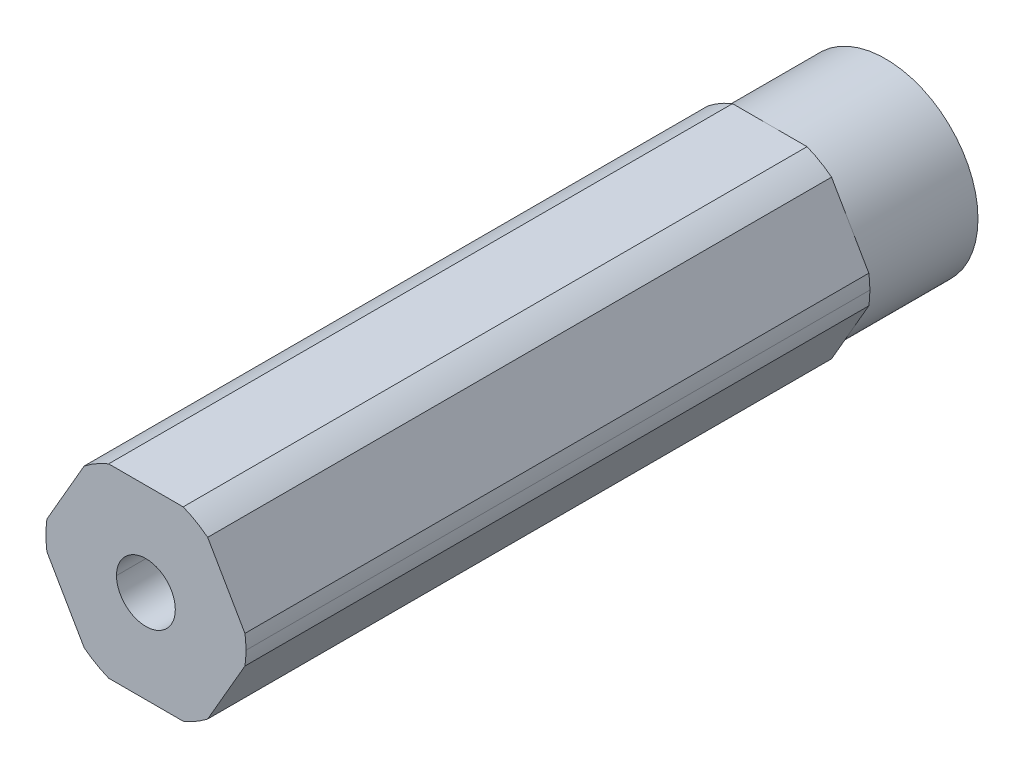
ISO-10303-21;
HEADER;
FILE_DESCRIPTION(('STEP AP214'),'2;1');
FILE_NAME('part.step','',(''),(''),'','','');
FILE_SCHEMA(('AUTOMOTIVE_DESIGN { 1 0 10303 214 1 1 1 1 }'));
ENDSEC;
DATA;
#1=APPLICATION_CONTEXT('core data for automotive mechanical design processes');
#2=APPLICATION_PROTOCOL_DEFINITION('international standard','automotive_design',2000,#1);
#3=PRODUCT_CONTEXT('',#1,'mechanical');
#4=PRODUCT('Part','Part','',(#3));
#5=PRODUCT_RELATED_PRODUCT_CATEGORY('part','',(#4));
#6=PRODUCT_DEFINITION_FORMATION('','',#4);
#7=PRODUCT_DEFINITION_CONTEXT('part definition',#1,'design');
#8=PRODUCT_DEFINITION('design','',#6,#7);
#9=PRODUCT_DEFINITION_SHAPE('','',#8);
#10=(LENGTH_UNIT() NAMED_UNIT(*) SI_UNIT(.MILLI.,.METRE.));
#11=(NAMED_UNIT(*) PLANE_ANGLE_UNIT() SI_UNIT($,.RADIAN.));
#12=(NAMED_UNIT(*) SI_UNIT($,.STERADIAN.) SOLID_ANGLE_UNIT());
#13=UNCERTAINTY_MEASURE_WITH_UNIT(LENGTH_MEASURE(1.E-05),#10,'distance_accuracy_value','');
#14=(GEOMETRIC_REPRESENTATION_CONTEXT(3) GLOBAL_UNCERTAINTY_ASSIGNED_CONTEXT((#13)) GLOBAL_UNIT_ASSIGNED_CONTEXT((#10,
#11,#12)) REPRESENTATION_CONTEXT('',''));
#15=CARTESIAN_POINT('',(0.,0.,0.));
#16=DIRECTION('',(0.,0.,1.));
#17=DIRECTION('',(1.,0.,0.));
#18=AXIS2_PLACEMENT_3D('',#15,#16,#17);
#19=CARTESIAN_POINT('',(0.,0.,-457.2));
#20=DIRECTION('',(0.,0.,1.));
#21=DIRECTION('',(1.,0.,0.));
#22=AXIS2_PLACEMENT_3D('',#19,#20,#21);
#23=CYLINDRICAL_SURFACE('',#22,6.87);
#24=DIRECTION('',(0.,0.,-1.));
#25=VECTOR('',#24,1.);
#26=CARTESIAN_POINT('',(4.24149521323254,5.40431479062105,-457.2));
#27=LINE('',#26,#25);
#28=CARTESIAN_POINT('',(4.24149521323254,5.40431479062105,-406.4));
#29=VERTEX_POINT('',#28);
#30=CARTESIAN_POINT('',(4.24149521323254,5.40431479062105,-449.2498));
#31=VERTEX_POINT('',#30);
#32=EDGE_CURVE('E201',#29,#31,#27,.T.);
#33=ORIENTED_EDGE('',*,*,#32,.T.);
#34=CARTESIAN_POINT('',(0.,0.,-449.2498));
#35=DIRECTION('',(0.,0.,-1.));
#36=DIRECTION('',(-1.,0.,0.));
#37=AXIS2_PLACEMENT_3D('',#34,#35,#36);
#38=CIRCLE('',#37,6.87);
#39=CARTESIAN_POINT('',(2.55952629210954,6.3754,-449.2498));
#40=VERTEX_POINT('',#39);
#41=EDGE_CURVE('E355',#40,#31,#38,.T.);
#42=ORIENTED_EDGE('',*,*,#41,.F.);
#43=DIRECTION('',(0.,0.,1.));
#44=VECTOR('',#43,1.);
#45=CARTESIAN_POINT('',(2.55952629210952,6.3754,-457.2));
#46=LINE('',#45,#44);
#47=CARTESIAN_POINT('',(2.55952629210954,6.3754,-406.4));
#48=VERTEX_POINT('',#47);
#49=EDGE_CURVE('E199',#40,#48,#46,.T.);
#50=ORIENTED_EDGE('',*,*,#49,.T.);
#51=CARTESIAN_POINT('',(0.,0.,-406.4));
#52=DIRECTION('',(0.,0.,1.));
#53=DIRECTION('',(1.,0.,0.));
#54=AXIS2_PLACEMENT_3D('',#51,#52,#53);
#55=CIRCLE('',#54,6.87);
#56=EDGE_CURVE('E365',#48,#29,#55,.F.);
#57=ORIENTED_EDGE('',*,*,#56,.T.);
#58=EDGE_LOOP('',(#33,#42,#50,#57));
#59=FACE_BOUND('',#58,.T.);
#60=ADVANCED_FACE('F52',(#59),#23,.T.);
#61=CARTESIAN_POINT('',(0.,0.,-457.2));
#62=DIRECTION('',(0.,0.,1.));
#63=DIRECTION('',(1.,0.,0.));
#64=AXIS2_PLACEMENT_3D('',#61,#62,#63);
#65=CYLINDRICAL_SURFACE('',#64,6.87);
#66=DIRECTION('',(0.,0.,-1.));
#67=VECTOR('',#66,1.);
#68=CARTESIAN_POINT('',(-2.55952629210953,6.3754,-457.2));
#69=LINE('',#68,#67);
#70=CARTESIAN_POINT('',(-2.55952629210954,6.3754,-406.4));
#71=VERTEX_POINT('',#70);
#72=CARTESIAN_POINT('',(-2.55952629210954,6.3754,-449.2498));
#73=VERTEX_POINT('',#72);
#74=EDGE_CURVE('E191',#71,#73,#69,.T.);
#75=ORIENTED_EDGE('',*,*,#74,.T.);
#76=CARTESIAN_POINT('',(-4.24149521323254,5.40431479062105,-449.2498));
#77=VERTEX_POINT('',#76);
#78=EDGE_CURVE('E173',#77,#73,#38,.T.);
#79=ORIENTED_EDGE('',*,*,#78,.F.);
#80=DIRECTION('',(0.,0.,1.));
#81=VECTOR('',#80,1.);
#82=CARTESIAN_POINT('',(-4.24149521323255,5.40431479062104,-457.2));
#83=LINE('',#82,#81);
#84=CARTESIAN_POINT('',(-4.24149521323254,5.40431479062105,-406.4));
#85=VERTEX_POINT('',#84);
#86=EDGE_CURVE('E180',#77,#85,#83,.T.);
#87=ORIENTED_EDGE('',*,*,#86,.T.);
#88=EDGE_CURVE('E364',#85,#71,#55,.F.);
#89=ORIENTED_EDGE('',*,*,#88,.T.);
#90=EDGE_LOOP('',(#75,#79,#87,#89));
#91=FACE_BOUND('',#90,.T.);
#92=ADVANCED_FACE('F277',(#91),#65,.T.);
#93=CARTESIAN_POINT('',(0.,0.,-457.2));
#94=DIRECTION('',(0.,0.,1.));
#95=DIRECTION('',(1.,0.,0.));
#96=AXIS2_PLACEMENT_3D('',#93,#94,#95);
#97=CYLINDRICAL_SURFACE('',#96,6.87);
#98=DIRECTION('',(0.,0.,-1.));
#99=VECTOR('',#98,1.);
#100=CARTESIAN_POINT('',(-6.80102150534208,0.97108520937896,-457.2));
#101=LINE('',#100,#99);
#102=CARTESIAN_POINT('',(-6.80102150534208,0.971085209378946,-406.4));
#103=VERTEX_POINT('',#102);
#104=CARTESIAN_POINT('',(-6.80102150534208,0.971085209378946,-449.2498));
#105=VERTEX_POINT('',#104);
#106=EDGE_CURVE('E179',#103,#105,#101,.T.);
#107=ORIENTED_EDGE('',*,*,#106,.T.);
#108=CARTESIAN_POINT('',(-6.80102150534208,-0.971085209378946,-449.2498));
#109=VERTEX_POINT('',#108);
#110=EDGE_CURVE('E160',#109,#105,#38,.T.);
#111=ORIENTED_EDGE('',*,*,#110,.F.);
#112=DIRECTION('',(0.,0.,1.));
#113=VECTOR('',#112,1.);
#114=CARTESIAN_POINT('',(-6.80102150534208,-0.971085209378962,-457.2));
#115=LINE('',#114,#113);
#116=CARTESIAN_POINT('',(-6.80102150534208,-0.971085209378946,-406.4));
#117=VERTEX_POINT('',#116);
#118=EDGE_CURVE('E187',#109,#117,#115,.T.);
#119=ORIENTED_EDGE('',*,*,#118,.T.);
#120=EDGE_CURVE('E186',#117,#103,#55,.F.);
#121=ORIENTED_EDGE('',*,*,#120,.T.);
#122=EDGE_LOOP('',(#107,#111,#119,#121));
#123=FACE_BOUND('',#122,.T.);
#124=ADVANCED_FACE('F184',(#123),#97,.T.);
#125=CARTESIAN_POINT('',(0.,0.,-457.2));
#126=DIRECTION('',(0.,0.,1.));
#127=DIRECTION('',(1.,0.,0.));
#128=AXIS2_PLACEMENT_3D('',#125,#126,#127);
#129=CYLINDRICAL_SURFACE('',#128,6.87);
#130=DIRECTION('',(0.,0.,-1.));
#131=VECTOR('',#130,1.);
#132=CARTESIAN_POINT('',(-4.24149521323255,-5.40431479062104,-457.2));
#133=LINE('',#132,#131);
#134=CARTESIAN_POINT('',(-4.24149521323254,-5.40431479062105,-406.4));
#135=VERTEX_POINT('',#134);
#136=CARTESIAN_POINT('',(-4.24149521323254,-5.40431479062105,-449.2498));
#137=VERTEX_POINT('',#136);
#138=EDGE_CURVE('E189',#135,#137,#133,.T.);
#139=ORIENTED_EDGE('',*,*,#138,.T.);
#140=CARTESIAN_POINT('',(-2.55952629210954,-6.3754,-449.2498));
#141=VERTEX_POINT('',#140);
#142=EDGE_CURVE('E170',#141,#137,#38,.T.);
#143=ORIENTED_EDGE('',*,*,#142,.F.);
#144=DIRECTION('',(0.,0.,1.));
#145=VECTOR('',#144,1.);
#146=CARTESIAN_POINT('',(-2.55952629210953,-6.3754,-457.2));
#147=LINE('',#146,#145);
#148=CARTESIAN_POINT('',(-2.55952629210954,-6.3754,-406.4));
#149=VERTEX_POINT('',#148);
#150=EDGE_CURVE('E196',#141,#149,#147,.T.);
#151=ORIENTED_EDGE('',*,*,#150,.T.);
#152=EDGE_CURVE('E343',#149,#135,#55,.F.);
#153=ORIENTED_EDGE('',*,*,#152,.T.);
#154=EDGE_LOOP('',(#139,#143,#151,#153));
#155=FACE_BOUND('',#154,.T.);
#156=ADVANCED_FACE('F316',(#155),#129,.T.);
#157=CARTESIAN_POINT('',(0.,0.,-457.2));
#158=DIRECTION('',(0.,0.,1.));
#159=DIRECTION('',(1.,0.,0.));
#160=AXIS2_PLACEMENT_3D('',#157,#158,#159);
#161=CYLINDRICAL_SURFACE('',#160,6.87);
#162=DIRECTION('',(0.,0.,-1.));
#163=VECTOR('',#162,1.);
#164=CARTESIAN_POINT('',(2.55952629210953,-6.3754,-457.2));
#165=LINE('',#164,#163);
#166=CARTESIAN_POINT('',(2.55952629210954,-6.3754,-406.4));
#167=VERTEX_POINT('',#166);
#168=CARTESIAN_POINT('',(2.55952629210954,-6.3754,-449.2498));
#169=VERTEX_POINT('',#168);
#170=EDGE_CURVE('E198',#167,#169,#165,.T.);
#171=ORIENTED_EDGE('',*,*,#170,.T.);
#172=CARTESIAN_POINT('',(4.24149521323254,-5.40431479062105,-449.2498));
#173=VERTEX_POINT('',#172);
#174=EDGE_CURVE('E350',#173,#169,#38,.T.);
#175=ORIENTED_EDGE('',*,*,#174,.F.);
#176=DIRECTION('',(0.,0.,1.));
#177=VECTOR('',#176,1.);
#178=CARTESIAN_POINT('',(4.24149521323255,-5.40431479062104,-457.2));
#179=LINE('',#178,#177);
#180=CARTESIAN_POINT('',(4.24149521323254,-5.40431479062105,-406.4));
#181=VERTEX_POINT('',#180);
#182=EDGE_CURVE('E221',#173,#181,#179,.T.);
#183=ORIENTED_EDGE('',*,*,#182,.T.);
#184=EDGE_CURVE('E247',#181,#167,#55,.F.);
#185=ORIENTED_EDGE('',*,*,#184,.T.);
#186=EDGE_LOOP('',(#171,#175,#183,#185));
#187=FACE_BOUND('',#186,.T.);
#188=ADVANCED_FACE('F310',(#187),#161,.T.);
#189=CARTESIAN_POINT('',(0.,0.,-457.2));
#190=DIRECTION('',(0.,0.,1.));
#191=DIRECTION('',(1.,0.,0.));
#192=AXIS2_PLACEMENT_3D('',#189,#190,#191);
#193=CYLINDRICAL_SURFACE('',#192,6.87);
#194=DIRECTION('',(0.,0.,1.));
#195=VECTOR('',#194,1.);
#196=CARTESIAN_POINT('',(6.87,0.,-457.2));
#197=LINE('',#196,#195);
#198=CARTESIAN_POINT('',(6.87,0.,-449.2498));
#199=VERTEX_POINT('',#198);
#200=CARTESIAN_POINT('',(6.87,0.,-406.4));
#201=VERTEX_POINT('',#200);
#202=EDGE_CURVE('E206',#199,#201,#197,.T.);
#203=ORIENTED_EDGE('',*,*,#202,.F.);
#204=CARTESIAN_POINT('',(6.80102150534208,0.971085209378946,-449.2498));
#205=VERTEX_POINT('',#204);
#206=EDGE_CURVE('E67',#205,#199,#38,.T.);
#207=ORIENTED_EDGE('',*,*,#206,.F.);
#208=DIRECTION('',(0.,0.,1.));
#209=VECTOR('',#208,1.);
#210=CARTESIAN_POINT('',(6.80102150534208,0.971085209378949,-457.2));
#211=LINE('',#210,#209);
#212=CARTESIAN_POINT('',(6.80102150534208,0.971085209378946,-406.4));
#213=VERTEX_POINT('',#212);
#214=EDGE_CURVE('E219',#205,#213,#211,.T.);
#215=ORIENTED_EDGE('',*,*,#214,.T.);
#216=EDGE_CURVE('E248',#213,#201,#55,.F.);
#217=ORIENTED_EDGE('',*,*,#216,.T.);
#218=EDGE_LOOP('',(#203,#207,#215,#217));
#219=FACE_BOUND('',#218,.T.);
#220=ADVANCED_FACE('F300',(#219),#193,.T.);
#221=CARTESIAN_POINT('',(-3.68083890619154,-6.3754,457.2));
#222=DIRECTION('',(0.,1.,0.));
#223=DIRECTION('',(1.,0.,0.));
#224=AXIS2_PLACEMENT_3D('',#221,#222,#223);
#225=PLANE('',#224);
#226=DIRECTION('',(-1.,0.,0.));
#227=VECTOR('',#226,1.);
#228=CARTESIAN_POINT('',(-3.68083890619154,-6.3754,-449.2498));
#229=LINE('',#228,#227);
#230=EDGE_CURVE('E249',#169,#141,#229,.T.);
#231=ORIENTED_EDGE('',*,*,#230,.F.);
#232=ORIENTED_EDGE('',*,*,#170,.F.);
#233=DIRECTION('',(1.,0.,0.));
#234=VECTOR('',#233,1.);
#235=CARTESIAN_POINT('',(-3.68083890619154,-6.3754,-406.4));
#236=LINE('',#235,#234);
#237=EDGE_CURVE('E217',#149,#167,#236,.T.);
#238=ORIENTED_EDGE('',*,*,#237,.F.);
#239=ORIENTED_EDGE('',*,*,#150,.F.);
#240=EDGE_LOOP('',(#231,#232,#238,#239));
#241=FACE_BOUND('',#240,.T.);
#242=ADVANCED_FACE('F296',(#241),#225,.F.);
#243=CARTESIAN_POINT('',(-7.36167781238308,0.,457.2));
#244=DIRECTION('',(0.866025403784439,0.5,0.));
#245=DIRECTION('',(0.,0.,-1.));
#246=AXIS2_PLACEMENT_3D('',#243,#244,#245);
#247=PLANE('',#246);
#248=DIRECTION('',(-0.5,0.866025403784439,0.));
#249=VECTOR('',#248,1.);
#250=CARTESIAN_POINT('',(-7.36167781238308,0.,-449.2498));
#251=LINE('',#250,#249);
#252=EDGE_CURVE('E166',#137,#109,#251,.T.);
#253=ORIENTED_EDGE('',*,*,#252,.F.);
#254=ORIENTED_EDGE('',*,*,#138,.F.);
#255=DIRECTION('',(0.5,-0.866025403784439,0.));
#256=VECTOR('',#255,1.);
#257=CARTESIAN_POINT('',(-7.36167781238308,0.,-406.4));
#258=LINE('',#257,#256);
#259=EDGE_CURVE('E234',#117,#135,#258,.T.);
#260=ORIENTED_EDGE('',*,*,#259,.F.);
#261=ORIENTED_EDGE('',*,*,#118,.F.);
#262=EDGE_LOOP('',(#253,#254,#260,#261));
#263=FACE_BOUND('',#262,.T.);
#264=ADVANCED_FACE('F293',(#263),#247,.F.);
#265=CARTESIAN_POINT('',(-3.68083890619154,6.3754,457.2));
#266=DIRECTION('',(0.866025403784439,-0.5,0.));
#267=DIRECTION('',(0.,0.,-1.));
#268=AXIS2_PLACEMENT_3D('',#265,#266,#267);
#269=PLANE('',#268);
#270=DIRECTION('',(0.5,0.866025403784439,0.));
#271=VECTOR('',#270,1.);
#272=CARTESIAN_POINT('',(-3.68083890619154,6.3754,-449.2498));
#273=LINE('',#272,#271);
#274=EDGE_CURVE('E163',#105,#77,#273,.T.);
#275=ORIENTED_EDGE('',*,*,#274,.F.);
#276=ORIENTED_EDGE('',*,*,#106,.F.);
#277=DIRECTION('',(-0.5,-0.866025403784439,0.));
#278=VECTOR('',#277,1.);
#279=CARTESIAN_POINT('',(-3.68083890619154,6.3754,-406.4));
#280=LINE('',#279,#278);
#281=EDGE_CURVE('E236',#85,#103,#280,.T.);
#282=ORIENTED_EDGE('',*,*,#281,.F.);
#283=ORIENTED_EDGE('',*,*,#86,.F.);
#284=EDGE_LOOP('',(#275,#276,#282,#283));
#285=FACE_BOUND('',#284,.T.);
#286=ADVANCED_FACE('F177',(#285),#269,.F.);
#287=CARTESIAN_POINT('',(3.68083890619154,6.3754,457.2));
#288=DIRECTION('',(0.,-1.,0.));
#289=DIRECTION('',(0.,0.,-1.));
#290=AXIS2_PLACEMENT_3D('',#287,#288,#289);
#291=PLANE('',#290);
#292=DIRECTION('',(1.,0.,0.));
#293=VECTOR('',#292,1.);
#294=CARTESIAN_POINT('',(3.68083890619154,6.3754,-449.2498));
#295=LINE('',#294,#293);
#296=EDGE_CURVE('E181',#73,#40,#295,.T.);
#297=ORIENTED_EDGE('',*,*,#296,.F.);
#298=ORIENTED_EDGE('',*,*,#74,.F.);
#299=DIRECTION('',(-1.,0.,0.));
#300=VECTOR('',#299,1.);
#301=CARTESIAN_POINT('',(3.68083890619154,6.3754,-406.4));
#302=LINE('',#301,#300);
#303=EDGE_CURVE('E238',#48,#71,#302,.T.);
#304=ORIENTED_EDGE('',*,*,#303,.F.);
#305=ORIENTED_EDGE('',*,*,#49,.F.);
#306=EDGE_LOOP('',(#297,#298,#304,#305));
#307=FACE_BOUND('',#306,.T.);
#308=ADVANCED_FACE('F289',(#307),#291,.F.);
#309=CARTESIAN_POINT('',(7.36167781238308,0.,457.2));
#310=DIRECTION('',(-0.866025403784439,-0.5,0.));
#311=DIRECTION('',(-0.5,0.866025403784439,0.));
#312=AXIS2_PLACEMENT_3D('',#309,#310,#311);
#313=PLANE('',#312);
#314=DIRECTION('',(0.5,-0.866025403784439,0.));
#315=VECTOR('',#314,1.);
#316=CARTESIAN_POINT('',(7.36167781238308,0.,-449.2498));
#317=LINE('',#316,#315);
#318=EDGE_CURVE('E253',#31,#205,#317,.T.);
#319=ORIENTED_EDGE('',*,*,#318,.F.);
#320=ORIENTED_EDGE('',*,*,#32,.F.);
#321=DIRECTION('',(-0.5,0.866025403784439,0.));
#322=VECTOR('',#321,1.);
#323=CARTESIAN_POINT('',(7.36167781238308,0.,-406.4));
#324=LINE('',#323,#322);
#325=EDGE_CURVE('E240',#213,#29,#324,.T.);
#326=ORIENTED_EDGE('',*,*,#325,.F.);
#327=ORIENTED_EDGE('',*,*,#214,.F.);
#328=EDGE_LOOP('',(#319,#320,#326,#327));
#329=FACE_BOUND('',#328,.T.);
#330=ADVANCED_FACE('F287',(#329),#313,.F.);
#331=CARTESIAN_POINT('',(3.68083890619154,-6.3754,457.2));
#332=DIRECTION('',(-0.866025403784439,0.5,0.));
#333=DIRECTION('',(0.,0.,1.));
#334=AXIS2_PLACEMENT_3D('',#331,#332,#333);
#335=PLANE('',#334);
#336=DIRECTION('',(-0.5,-0.866025403784439,0.));
#337=VECTOR('',#336,1.);
#338=CARTESIAN_POINT('',(3.68083890619154,-6.3754,-449.2498));
#339=LINE('',#338,#337);
#340=CARTESIAN_POINT('',(6.80102150534208,-0.971085209378958,-449.2498));
#341=VERTEX_POINT('',#340);
#342=EDGE_CURVE('E255',#341,#173,#339,.T.);
#343=ORIENTED_EDGE('',*,*,#342,.F.);
#344=DIRECTION('',(0.,0.,-1.));
#345=VECTOR('',#344,1.);
#346=CARTESIAN_POINT('',(6.80102150534208,-0.971085209378962,-457.2));
#347=LINE('',#346,#345);
#348=CARTESIAN_POINT('',(6.80102150534208,-0.971085209378962,-406.4));
#349=VERTEX_POINT('',#348);
#350=EDGE_CURVE('E223',#349,#341,#347,.T.);
#351=ORIENTED_EDGE('',*,*,#350,.F.);
#352=DIRECTION('',(0.5,0.866025403784439,0.));
#353=VECTOR('',#352,1.);
#354=CARTESIAN_POINT('',(3.68083890619154,-6.3754,-406.4));
#355=LINE('',#354,#353);
#356=EDGE_CURVE('E75',#181,#349,#355,.T.);
#357=ORIENTED_EDGE('',*,*,#356,.F.);
#358=ORIENTED_EDGE('',*,*,#182,.F.);
#359=EDGE_LOOP('',(#343,#351,#357,#358));
#360=FACE_BOUND('',#359,.T.);
#361=ADVANCED_FACE('F320',(#360),#335,.F.);
#362=CARTESIAN_POINT('',(0.,0.,-457.2));
#363=DIRECTION('',(0.,0.,1.));
#364=DIRECTION('',(1.,0.,0.));
#365=AXIS2_PLACEMENT_3D('',#362,#363,#364);
#366=CYLINDRICAL_SURFACE('',#365,6.87);
#367=ORIENTED_EDGE('',*,*,#350,.T.);
#368=EDGE_CURVE('E353',#199,#341,#38,.T.);
#369=ORIENTED_EDGE('',*,*,#368,.F.);
#370=ORIENTED_EDGE('',*,*,#202,.T.);
#371=EDGE_CURVE('E245',#201,#349,#55,.F.);
#372=ORIENTED_EDGE('',*,*,#371,.T.);
#373=EDGE_LOOP('',(#367,#369,#370,#372));
#374=FACE_BOUND('',#373,.T.);
#375=ADVANCED_FACE('F306',(#374),#366,.T.);
#376=CARTESIAN_POINT('',(0.,0.,-457.2));
#377=DIRECTION('',(0.,0.,1.));
#378=DIRECTION('',(1.,0.,0.));
#379=AXIS2_PLACEMENT_3D('',#376,#377,#378);
#380=PLANE('',#379);
#381=CARTESIAN_POINT('',(0.,0.,-457.2));
#382=DIRECTION('',(0.,0.,1.));
#383=DIRECTION('',(1.,0.,0.));
#384=AXIS2_PLACEMENT_3D('',#381,#382,#383);
#385=CIRCLE('',#384,2.0193);
#386=CARTESIAN_POINT('',(2.0193,0.,-457.2));
#387=VERTEX_POINT('',#386);
#388=CARTESIAN_POINT('',(-2.0193,0.,-457.2));
#389=VERTEX_POINT('',#388);
#390=EDGE_CURVE('E60',#387,#389,#385,.T.);
#391=ORIENTED_EDGE('',*,*,#390,.T.);
#392=CARTESIAN_POINT('',(0.,0.,-457.2));
#393=DIRECTION('',(0.,0.,1.));
#394=DIRECTION('',(1.,0.,0.));
#395=AXIS2_PLACEMENT_3D('',#392,#393,#394);
#396=CIRCLE('',#395,2.0193);
#397=EDGE_CURVE('E213',#389,#387,#396,.T.);
#398=ORIENTED_EDGE('',*,*,#397,.T.);
#399=EDGE_LOOP('',(#391,#398));
#400=FACE_BOUND('',#399,.T.);
#401=CARTESIAN_POINT('',(0.,0.,-457.2));
#402=DIRECTION('',(0.,0.,-1.));
#403=DIRECTION('',(-1.,0.,0.));
#404=AXIS2_PLACEMENT_3D('',#401,#402,#403);
#405=CIRCLE('',#404,6.35);
#406=CARTESIAN_POINT('',(-6.35,0.,-457.2));
#407=VERTEX_POINT('',#406);
#408=EDGE_CURVE('E257',#407,#407,#405,.T.);
#409=ORIENTED_EDGE('',*,*,#408,.T.);
#410=EDGE_LOOP('',(#409));
#411=FACE_BOUND('',#410,.T.);
#412=ADVANCED_FACE('F302',(#400,#411),#380,.F.);
#413=CARTESIAN_POINT('',(0.,0.,-457.2));
#414=DIRECTION('',(0.,0.,1.));
#415=DIRECTION('',(1.,0.,0.));
#416=AXIS2_PLACEMENT_3D('',#413,#414,#415);
#417=CYLINDRICAL_SURFACE('',#416,2.0193);
#418=CARTESIAN_POINT('',(0.,0.,-406.4));
#419=DIRECTION('',(0.,0.,1.));
#420=DIRECTION('',(1.,0.,0.));
#421=AXIS2_PLACEMENT_3D('',#418,#419,#420);
#422=CIRCLE('',#421,2.0193);
#423=CARTESIAN_POINT('',(-2.0193,0.,-406.4));
#424=VERTEX_POINT('',#423);
#425=CARTESIAN_POINT('',(2.0193,0.,-406.4));
#426=VERTEX_POINT('',#425);
#427=EDGE_CURVE('E243',#424,#426,#422,.F.);
#428=ORIENTED_EDGE('',*,*,#427,.F.);
#429=DIRECTION('',(0.,0.,1.));
#430=VECTOR('',#429,1.);
#431=CARTESIAN_POINT('',(-2.0193,0.,-457.2));
#432=LINE('',#431,#430);
#433=EDGE_CURVE('E207',#389,#424,#432,.T.);
#434=ORIENTED_EDGE('',*,*,#433,.F.);
#435=ORIENTED_EDGE('',*,*,#390,.F.);
#436=DIRECTION('',(0.,0.,1.));
#437=VECTOR('',#436,1.);
#438=CARTESIAN_POINT('',(2.0193,0.,-457.2));
#439=LINE('',#438,#437);
#440=EDGE_CURVE('E202',#387,#426,#439,.T.);
#441=ORIENTED_EDGE('',*,*,#440,.T.);
#442=EDGE_LOOP('',(#428,#434,#435,#441));
#443=FACE_BOUND('',#442,.T.);
#444=ADVANCED_FACE('F305',(#443),#417,.F.);
#445=CARTESIAN_POINT('',(0.,0.,-457.2));
#446=DIRECTION('',(0.,0.,1.));
#447=DIRECTION('',(1.,0.,0.));
#448=AXIS2_PLACEMENT_3D('',#445,#446,#447);
#449=CYLINDRICAL_SURFACE('',#448,2.0193);
#450=CARTESIAN_POINT('',(0.,0.,-406.4));
#451=DIRECTION('',(0.,0.,1.));
#452=DIRECTION('',(1.,0.,0.));
#453=AXIS2_PLACEMENT_3D('',#450,#451,#452);
#454=CIRCLE('',#453,2.0193);
#455=EDGE_CURVE('E13',#426,#424,#454,.F.);
#456=ORIENTED_EDGE('',*,*,#455,.F.);
#457=ORIENTED_EDGE('',*,*,#440,.F.);
#458=ORIENTED_EDGE('',*,*,#397,.F.);
#459=ORIENTED_EDGE('',*,*,#433,.T.);
#460=EDGE_LOOP('',(#456,#457,#458,#459));
#461=FACE_BOUND('',#460,.T.);
#462=ADVANCED_FACE('F54',(#461),#449,.F.);
#463=CARTESIAN_POINT('',(0.,0.,-406.4));
#464=DIRECTION('',(0.,0.,1.));
#465=DIRECTION('',(1.,0.,0.));
#466=AXIS2_PLACEMENT_3D('',#463,#464,#465);
#467=PLANE('',#466);
#468=ORIENTED_EDGE('',*,*,#427,.T.);
#469=ORIENTED_EDGE('',*,*,#455,.T.);
#470=EDGE_LOOP('',(#468,#469));
#471=FACE_BOUND('',#470,.T.);
#472=ORIENTED_EDGE('',*,*,#237,.T.);
#473=ORIENTED_EDGE('',*,*,#184,.F.);
#474=ORIENTED_EDGE('',*,*,#356,.T.);
#475=ORIENTED_EDGE('',*,*,#371,.F.);
#476=ORIENTED_EDGE('',*,*,#216,.F.);
#477=ORIENTED_EDGE('',*,*,#325,.T.);
#478=ORIENTED_EDGE('',*,*,#56,.F.);
#479=ORIENTED_EDGE('',*,*,#303,.T.);
#480=ORIENTED_EDGE('',*,*,#88,.F.);
#481=ORIENTED_EDGE('',*,*,#281,.T.);
#482=ORIENTED_EDGE('',*,*,#120,.F.);
#483=ORIENTED_EDGE('',*,*,#259,.T.);
#484=ORIENTED_EDGE('',*,*,#152,.F.);
#485=EDGE_LOOP('',(#472,#473,#474,#475,#476,#477,#478,#479,#480,#481,#482,#483,#484));
#486=FACE_BOUND('',#485,.T.);
#487=ADVANCED_FACE('F267',(#471,#486),#467,.T.);
#488=CARTESIAN_POINT('',(0.,0.,-449.2498));
#489=DIRECTION('',(0.,0.,-1.));
#490=DIRECTION('',(-1.,0.,0.));
#491=AXIS2_PLACEMENT_3D('',#488,#489,#490);
#492=PLANE('',#491);
#493=CARTESIAN_POINT('',(0.,0.,-449.2498));
#494=DIRECTION('',(0.,0.,-1.));
#495=DIRECTION('',(-1.,0.,0.));
#496=AXIS2_PLACEMENT_3D('',#493,#494,#495);
#497=CIRCLE('',#496,6.35);
#498=CARTESIAN_POINT('',(-6.35,0.,-449.2498));
#499=VERTEX_POINT('',#498);
#500=EDGE_CURVE('E171',#499,#499,#497,.T.);
#501=ORIENTED_EDGE('',*,*,#500,.F.);
#502=EDGE_LOOP('',(#501));
#503=FACE_BOUND('',#502,.T.);
#504=ORIENTED_EDGE('',*,*,#230,.T.);
#505=ORIENTED_EDGE('',*,*,#142,.T.);
#506=ORIENTED_EDGE('',*,*,#252,.T.);
#507=ORIENTED_EDGE('',*,*,#110,.T.);
#508=ORIENTED_EDGE('',*,*,#274,.T.);
#509=ORIENTED_EDGE('',*,*,#78,.T.);
#510=ORIENTED_EDGE('',*,*,#296,.T.);
#511=ORIENTED_EDGE('',*,*,#41,.T.);
#512=ORIENTED_EDGE('',*,*,#318,.T.);
#513=ORIENTED_EDGE('',*,*,#206,.T.);
#514=ORIENTED_EDGE('',*,*,#368,.T.);
#515=ORIENTED_EDGE('',*,*,#342,.T.);
#516=ORIENTED_EDGE('',*,*,#174,.T.);
#517=EDGE_LOOP('',(#504,#505,#506,#507,#508,#509,#510,#511,#512,#513,#514,#515,#516));
#518=FACE_BOUND('',#517,.T.);
#519=ADVANCED_FACE('F162',(#503,#518),#492,.T.);
#520=CARTESIAN_POINT('',(0.,0.,-449.2498));
#521=DIRECTION('',(0.,0.,-1.));
#522=DIRECTION('',(-1.,0.,0.));
#523=AXIS2_PLACEMENT_3D('',#520,#521,#522);
#524=CYLINDRICAL_SURFACE('',#523,6.35);
#525=ORIENTED_EDGE('',*,*,#500,.T.);
#526=EDGE_LOOP('',(#525));
#527=FACE_BOUND('',#526,.T.);
#528=ORIENTED_EDGE('',*,*,#408,.F.);
#529=EDGE_LOOP('',(#528));
#530=FACE_BOUND('',#529,.T.);
#531=ADVANCED_FACE('F263',(#527,#530),#524,.T.);
#532=CLOSED_SHELL('',(#60,#92,#124,#156,#188,#220,#242,#264,#286,#308,#330,#361,#375,#412,#444,
#462,#487,#519,#531));
#533=MANIFOLD_SOLID_BREP('B2',#532);
#534=ADVANCED_BREP_SHAPE_REPRESENTATION('',(#18,#533),#14);
#535=SHAPE_DEFINITION_REPRESENTATION(#9,#534);
ENDSEC;
END-ISO-10303-21;
